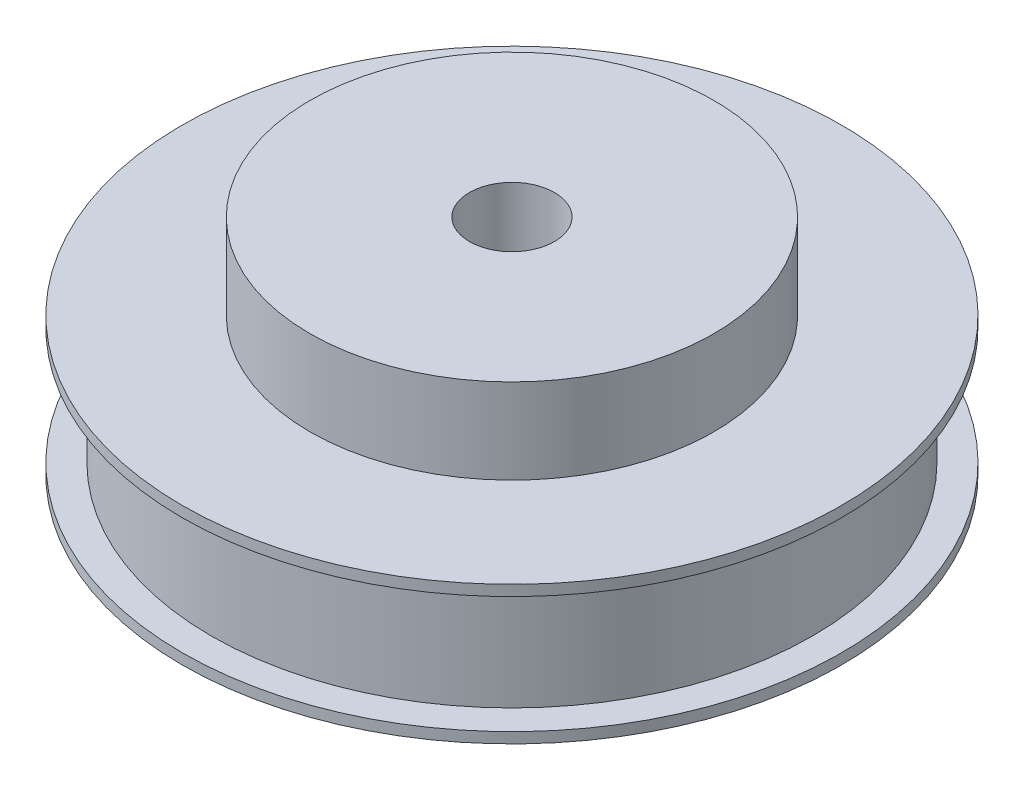
ISO-10303-21;
HEADER;
FILE_DESCRIPTION(('STEP AP214'),'2;1');
FILE_NAME('part.step','',(''),(''),'','','');
FILE_SCHEMA(('AUTOMOTIVE_DESIGN { 1 0 10303 214 1 1 1 1 }'));
ENDSEC;
DATA;
#1=APPLICATION_CONTEXT('core data for automotive mechanical design processes');
#2=APPLICATION_PROTOCOL_DEFINITION('international standard','automotive_design',2000,#1);
#3=PRODUCT_CONTEXT('',#1,'mechanical');
#4=PRODUCT('Part','Part','',(#3));
#5=PRODUCT_RELATED_PRODUCT_CATEGORY('part','',(#4));
#6=PRODUCT_DEFINITION_FORMATION('','',#4);
#7=PRODUCT_DEFINITION_CONTEXT('part definition',#1,'design');
#8=PRODUCT_DEFINITION('design','',#6,#7);
#9=PRODUCT_DEFINITION_SHAPE('','',#8);
#10=(LENGTH_UNIT() NAMED_UNIT(*) SI_UNIT(.MILLI.,.METRE.));
#11=(NAMED_UNIT(*) PLANE_ANGLE_UNIT() SI_UNIT($,.RADIAN.));
#12=(NAMED_UNIT(*) SI_UNIT($,.STERADIAN.) SOLID_ANGLE_UNIT());
#13=UNCERTAINTY_MEASURE_WITH_UNIT(LENGTH_MEASURE(1.E-05),#10,'distance_accuracy_value','');
#14=(GEOMETRIC_REPRESENTATION_CONTEXT(3) GLOBAL_UNCERTAINTY_ASSIGNED_CONTEXT((#13)) GLOBAL_UNIT_ASSIGNED_CONTEXT((#10,
#11,#12)) REPRESENTATION_CONTEXT('',''));
#15=CARTESIAN_POINT('',(0.,0.,0.));
#16=DIRECTION('',(0.,0.,1.));
#17=DIRECTION('',(1.,0.,0.));
#18=AXIS2_PLACEMENT_3D('',#15,#16,#17);
#19=CARTESIAN_POINT('',(0.,1.,0.));
#20=DIRECTION('',(0.,-1.,0.));
#21=DIRECTION('',(0.,0.,-1.));
#22=AXIS2_PLACEMENT_3D('',#19,#20,#21);
#23=CYLINDRICAL_SURFACE('',#22,31.);
#24=CARTESIAN_POINT('',(0.,1.,0.));
#25=DIRECTION('',(0.,1.,0.));
#26=DIRECTION('',(0.,0.,1.));
#27=AXIS2_PLACEMENT_3D('',#24,#25,#26);
#28=CIRCLE('',#27,31.);
#29=CARTESIAN_POINT('',(0.,1.,31.));
#30=VERTEX_POINT('',#29);
#31=EDGE_CURVE('E45',#30,#30,#28,.T.);
#32=ORIENTED_EDGE('',*,*,#31,.F.);
#33=EDGE_LOOP('',(#32));
#34=FACE_BOUND('',#33,.T.);
#35=CARTESIAN_POINT('',(0.,0.,0.));
#36=DIRECTION('',(0.,1.,0.));
#37=DIRECTION('',(0.,0.,1.));
#38=AXIS2_PLACEMENT_3D('',#35,#36,#37);
#39=CIRCLE('',#38,31.);
#40=CARTESIAN_POINT('',(0.,0.,31.));
#41=VERTEX_POINT('',#40);
#42=EDGE_CURVE('E36',#41,#41,#39,.T.);
#43=ORIENTED_EDGE('',*,*,#42,.T.);
#44=EDGE_LOOP('',(#43));
#45=FACE_BOUND('',#44,.T.);
#46=ADVANCED_FACE('F33',(#34,#45),#23,.T.);
#47=CARTESIAN_POINT('',(0.,1.,0.));
#48=DIRECTION('',(0.,1.,0.));
#49=DIRECTION('',(0.,0.,1.));
#50=AXIS2_PLACEMENT_3D('',#47,#48,#49);
#51=PLANE('',#50);
#52=CARTESIAN_POINT('',(0.,1.,0.));
#53=DIRECTION('',(0.,1.,0.));
#54=DIRECTION('',(0.,0.,1.));
#55=AXIS2_PLACEMENT_3D('',#52,#53,#54);
#56=CIRCLE('',#55,28.27);
#57=CARTESIAN_POINT('',(0.,1.,28.27));
#58=VERTEX_POINT('',#57);
#59=EDGE_CURVE('E40',#58,#58,#56,.T.);
#60=ORIENTED_EDGE('',*,*,#59,.F.);
#61=EDGE_LOOP('',(#60));
#62=FACE_BOUND('',#61,.T.);
#63=ORIENTED_EDGE('',*,*,#31,.T.);
#64=EDGE_LOOP('',(#63));
#65=FACE_BOUND('',#64,.T.);
#66=ADVANCED_FACE('F69',(#62,#65),#51,.T.);
#67=CARTESIAN_POINT('',(0.,0.,0.));
#68=DIRECTION('',(0.,1.,0.));
#69=DIRECTION('',(0.,0.,1.));
#70=AXIS2_PLACEMENT_3D('',#67,#68,#69);
#71=PLANE('',#70);
#72=CARTESIAN_POINT('',(0.,0.,0.));
#73=DIRECTION('',(0.,1.,0.));
#74=DIRECTION('',(0.,0.,1.));
#75=AXIS2_PLACEMENT_3D('',#72,#73,#74);
#76=CIRCLE('',#75,4.);
#77=CARTESIAN_POINT('',(0.,0.,4.));
#78=VERTEX_POINT('',#77);
#79=EDGE_CURVE('E164',#78,#78,#76,.T.);
#80=ORIENTED_EDGE('',*,*,#79,.T.);
#81=EDGE_LOOP('',(#80));
#82=FACE_BOUND('',#81,.T.);
#83=ORIENTED_EDGE('',*,*,#42,.F.);
#84=EDGE_LOOP('',(#83));
#85=FACE_BOUND('',#84,.T.);
#86=ADVANCED_FACE('F66',(#82,#85),#71,.F.);
#87=CARTESIAN_POINT('',(0.,12.,0.));
#88=DIRECTION('',(0.,-1.,0.));
#89=DIRECTION('',(0.,0.,-1.));
#90=AXIS2_PLACEMENT_3D('',#87,#88,#89);
#91=CYLINDRICAL_SURFACE('',#90,28.27);
#92=CARTESIAN_POINT('',(0.,12.,0.));
#93=DIRECTION('',(0.,1.,0.));
#94=DIRECTION('',(0.,0.,1.));
#95=AXIS2_PLACEMENT_3D('',#92,#93,#94);
#96=CIRCLE('',#95,28.27);
#97=CARTESIAN_POINT('',(0.,12.,28.27));
#98=VERTEX_POINT('',#97);
#99=EDGE_CURVE('E54',#98,#98,#96,.T.);
#100=ORIENTED_EDGE('',*,*,#99,.F.);
#101=EDGE_LOOP('',(#100));
#102=FACE_BOUND('',#101,.T.);
#103=ORIENTED_EDGE('',*,*,#59,.T.);
#104=EDGE_LOOP('',(#103));
#105=FACE_BOUND('',#104,.T.);
#106=ADVANCED_FACE('F68',(#102,#105),#91,.T.);
#107=CARTESIAN_POINT('',(0.,13.,0.));
#108=DIRECTION('',(0.,-1.,0.));
#109=DIRECTION('',(0.,0.,-1.));
#110=AXIS2_PLACEMENT_3D('',#107,#108,#109);
#111=CYLINDRICAL_SURFACE('',#110,31.);
#112=CARTESIAN_POINT('',(0.,13.,0.));
#113=DIRECTION('',(0.,1.,0.));
#114=DIRECTION('',(0.,0.,1.));
#115=AXIS2_PLACEMENT_3D('',#112,#113,#114);
#116=CIRCLE('',#115,31.);
#117=CARTESIAN_POINT('',(0.,13.,31.));
#118=VERTEX_POINT('',#117);
#119=EDGE_CURVE('E51',#118,#118,#116,.T.);
#120=ORIENTED_EDGE('',*,*,#119,.F.);
#121=EDGE_LOOP('',(#120));
#122=FACE_BOUND('',#121,.T.);
#123=CARTESIAN_POINT('',(0.,12.,0.));
#124=DIRECTION('',(0.,1.,0.));
#125=DIRECTION('',(0.,0.,1.));
#126=AXIS2_PLACEMENT_3D('',#123,#124,#125);
#127=CIRCLE('',#126,31.);
#128=CARTESIAN_POINT('',(0.,12.,31.));
#129=VERTEX_POINT('',#128);
#130=EDGE_CURVE('E55',#129,#129,#127,.T.);
#131=ORIENTED_EDGE('',*,*,#130,.T.);
#132=EDGE_LOOP('',(#131));
#133=FACE_BOUND('',#132,.T.);
#134=ADVANCED_FACE('F75',(#122,#133),#111,.T.);
#135=CARTESIAN_POINT('',(0.,13.,0.));
#136=DIRECTION('',(0.,1.,0.));
#137=DIRECTION('',(0.,0.,1.));
#138=AXIS2_PLACEMENT_3D('',#135,#136,#137);
#139=PLANE('',#138);
#140=CARTESIAN_POINT('',(0.,13.,0.));
#141=DIRECTION('',(0.,1.,0.));
#142=DIRECTION('',(0.,0.,1.));
#143=AXIS2_PLACEMENT_3D('',#140,#141,#142);
#144=CIRCLE('',#143,19.);
#145=CARTESIAN_POINT('',(0.,13.,19.));
#146=VERTEX_POINT('',#145);
#147=EDGE_CURVE('E10',#146,#146,#144,.T.);
#148=ORIENTED_EDGE('',*,*,#147,.F.);
#149=EDGE_LOOP('',(#148));
#150=FACE_BOUND('',#149,.T.);
#151=ORIENTED_EDGE('',*,*,#119,.T.);
#152=EDGE_LOOP('',(#151));
#153=FACE_BOUND('',#152,.T.);
#154=ADVANCED_FACE('F105',(#150,#153),#139,.T.);
#155=CARTESIAN_POINT('',(0.,12.,0.));
#156=DIRECTION('',(0.,1.,0.));
#157=DIRECTION('',(0.,0.,1.));
#158=AXIS2_PLACEMENT_3D('',#155,#156,#157);
#159=PLANE('',#158);
#160=ORIENTED_EDGE('',*,*,#99,.T.);
#161=EDGE_LOOP('',(#160));
#162=FACE_BOUND('',#161,.T.);
#163=ORIENTED_EDGE('',*,*,#130,.F.);
#164=EDGE_LOOP('',(#163));
#165=FACE_BOUND('',#164,.T.);
#166=ADVANCED_FACE('F113',(#162,#165),#159,.F.);
#167=CARTESIAN_POINT('',(0.,21.,0.));
#168=DIRECTION('',(0.,-1.,0.));
#169=DIRECTION('',(0.,0.,-1.));
#170=AXIS2_PLACEMENT_3D('',#167,#168,#169);
#171=CYLINDRICAL_SURFACE('',#170,19.);
#172=CARTESIAN_POINT('',(0.,21.,0.));
#173=DIRECTION('',(0.,1.,0.));
#174=DIRECTION('',(0.,0.,1.));
#175=AXIS2_PLACEMENT_3D('',#172,#173,#174);
#176=CIRCLE('',#175,19.);
#177=CARTESIAN_POINT('',(0.,21.,19.));
#178=VERTEX_POINT('',#177);
#179=EDGE_CURVE('E49',#178,#178,#176,.T.);
#180=ORIENTED_EDGE('',*,*,#179,.F.);
#181=EDGE_LOOP('',(#180));
#182=FACE_BOUND('',#181,.T.);
#183=ORIENTED_EDGE('',*,*,#147,.T.);
#184=EDGE_LOOP('',(#183));
#185=FACE_BOUND('',#184,.T.);
#186=ADVANCED_FACE('F118',(#182,#185),#171,.T.);
#187=CARTESIAN_POINT('',(0.,21.,0.));
#188=DIRECTION('',(0.,1.,0.));
#189=DIRECTION('',(0.,0.,1.));
#190=AXIS2_PLACEMENT_3D('',#187,#188,#189);
#191=PLANE('',#190);
#192=CARTESIAN_POINT('',(0.,21.,0.));
#193=DIRECTION('',(0.,1.,0.));
#194=DIRECTION('',(0.,0.,1.));
#195=AXIS2_PLACEMENT_3D('',#192,#193,#194);
#196=CIRCLE('',#195,4.);
#197=CARTESIAN_POINT('',(0.,21.,4.));
#198=VERTEX_POINT('',#197);
#199=EDGE_CURVE('E167',#198,#198,#196,.T.);
#200=ORIENTED_EDGE('',*,*,#199,.F.);
#201=EDGE_LOOP('',(#200));
#202=FACE_BOUND('',#201,.T.);
#203=ORIENTED_EDGE('',*,*,#179,.T.);
#204=EDGE_LOOP('',(#203));
#205=FACE_BOUND('',#204,.T.);
#206=ADVANCED_FACE('F134',(#202,#205),#191,.T.);
#207=CARTESIAN_POINT('',(0.,0.,0.));
#208=DIRECTION('',(0.,1.,0.));
#209=DIRECTION('',(0.,0.,1.));
#210=AXIS2_PLACEMENT_3D('',#207,#208,#209);
#211=CYLINDRICAL_SURFACE('',#210,4.);
#212=CARTESIAN_POINT('',(0.,0.,4.));
#213=CARTESIAN_POINT('',(0.,0.21875,4.));
#214=CARTESIAN_POINT('',(0.,0.4375,4.));
#215=CARTESIAN_POINT('',(0.,0.875,4.));
#216=CARTESIAN_POINT('',(0.,1.09375,4.));
#217=CARTESIAN_POINT('',(0.,1.53125,4.));
#218=CARTESIAN_POINT('',(0.,1.75,4.));
#219=CARTESIAN_POINT('',(0.,2.1875,4.));
#220=CARTESIAN_POINT('',(0.,2.40625,4.));
#221=CARTESIAN_POINT('',(0.,2.84375,4.));
#222=CARTESIAN_POINT('',(0.,3.0625,4.));
#223=CARTESIAN_POINT('',(0.,3.5,4.));
#224=CARTESIAN_POINT('',(0.,3.71875,4.));
#225=CARTESIAN_POINT('',(0.,4.15625,4.));
#226=CARTESIAN_POINT('',(0.,4.375,4.));
#227=CARTESIAN_POINT('',(0.,4.8125,4.));
#228=CARTESIAN_POINT('',(0.,5.03125,4.));
#229=CARTESIAN_POINT('',(0.,5.46875,4.));
#230=CARTESIAN_POINT('',(0.,5.6875,4.));
#231=CARTESIAN_POINT('',(0.,6.125,4.));
#232=CARTESIAN_POINT('',(0.,6.34375,4.));
#233=CARTESIAN_POINT('',(0.,6.78125,4.));
#234=CARTESIAN_POINT('',(0.,7.,4.));
#235=CARTESIAN_POINT('',(0.,7.4375,4.));
#236=CARTESIAN_POINT('',(0.,7.65625,4.));
#237=CARTESIAN_POINT('',(0.,8.09375,4.));
#238=CARTESIAN_POINT('',(0.,8.3125,4.));
#239=CARTESIAN_POINT('',(0.,8.75,4.));
#240=CARTESIAN_POINT('',(0.,8.96875,4.));
#241=CARTESIAN_POINT('',(0.,9.40625,4.));
#242=CARTESIAN_POINT('',(0.,9.625,4.));
#243=CARTESIAN_POINT('',(0.,10.0625,4.));
#244=CARTESIAN_POINT('',(0.,10.28125,4.));
#245=CARTESIAN_POINT('',(0.,10.71875,4.));
#246=CARTESIAN_POINT('',(0.,10.9375,4.));
#247=CARTESIAN_POINT('',(0.,11.375,4.));
#248=CARTESIAN_POINT('',(0.,11.59375,4.));
#249=CARTESIAN_POINT('',(0.,12.03125,4.));
#250=CARTESIAN_POINT('',(0.,12.25,4.));
#251=CARTESIAN_POINT('',(0.,12.6875,4.));
#252=CARTESIAN_POINT('',(0.,12.90625,4.));
#253=CARTESIAN_POINT('',(0.,13.34375,4.));
#254=CARTESIAN_POINT('',(0.,13.5625,4.));
#255=CARTESIAN_POINT('',(0.,14.,4.));
#256=CARTESIAN_POINT('',(0.,14.21875,4.));
#257=CARTESIAN_POINT('',(0.,14.65625,4.));
#258=CARTESIAN_POINT('',(0.,14.875,4.));
#259=CARTESIAN_POINT('',(0.,15.3125,4.));
#260=CARTESIAN_POINT('',(0.,15.53125,4.));
#261=CARTESIAN_POINT('',(0.,15.96875,4.));
#262=CARTESIAN_POINT('',(0.,16.1875,4.));
#263=CARTESIAN_POINT('',(0.,16.625,4.));
#264=CARTESIAN_POINT('',(0.,16.84375,4.));
#265=CARTESIAN_POINT('',(0.,17.28125,4.));
#266=CARTESIAN_POINT('',(0.,17.5,4.));
#267=CARTESIAN_POINT('',(0.,17.9375,4.));
#268=CARTESIAN_POINT('',(0.,18.15625,4.));
#269=CARTESIAN_POINT('',(0.,18.59375,4.));
#270=CARTESIAN_POINT('',(0.,18.8125,4.));
#271=CARTESIAN_POINT('',(0.,19.25,4.));
#272=CARTESIAN_POINT('',(0.,19.46875,4.));
#273=CARTESIAN_POINT('',(0.,19.90625,4.));
#274=CARTESIAN_POINT('',(0.,20.125,4.));
#275=CARTESIAN_POINT('',(0.,20.5625,4.));
#276=CARTESIAN_POINT('',(0.,20.78125,4.));
#277=CARTESIAN_POINT('',(0.,21.,4.));
#278=B_SPLINE_CURVE_WITH_KNOTS('',3,(#212,#213,#214,#215,#216,#217,#218,#219,#220,#221,#222,
#223,#224,#225,#226,#227,#228,#229,#230,#231,#232,#233,#234,#235,#236,#237,#238,#239,#240,#241,
#242,#243,#244,#245,#246,#247,#248,#249,#250,#251,#252,#253,#254,#255,#256,#257,#258,#259,#260,
#261,#262,#263,#264,#265,#266,#267,#268,#269,#270,#271,#272,#273,#274,#275,#276,#277),
.UNSPECIFIED.,.F.,.F.,(4,2,2,2,2,2,2,2,2,2,2,2,2,2,2,2,2,2,2,2,2,2,2,2,2,2,2,2,2,2,2,2,4),(0.,
0.65625,1.3125,1.96875,2.625,3.28125,3.9375,4.59375,5.25,5.90625,6.5625,7.21875,7.875,8.53125,
9.1875,9.84375,10.5,11.15625,11.8125,12.46875,13.125,13.78125,14.4375,15.09375,15.75,16.40625,
17.0625,17.71875,18.375,19.03125,19.6875,20.34375,21.),.UNSPECIFIED.);
#279=EDGE_CURVE('BSEAM148',#78,#198,#278,.T.);
#280=ORIENTED_EDGE('',*,*,#79,.F.);
#281=ORIENTED_EDGE('',*,*,#199,.T.);
#282=ORIENTED_EDGE('',*,*,#279,.T.);
#283=ORIENTED_EDGE('',*,*,#279,.F.);
#284=EDGE_LOOP('',(#280,#282,#281,#283));
#285=FACE_BOUND('',#284,.T.);
#286=ADVANCED_FACE('F148',(#285),#211,.F.);
#287=CLOSED_SHELL('',(#46,#66,#86,#106,#134,#154,#166,#186,#206,#286));
#288=MANIFOLD_SOLID_BREP('B2',#287);
#289=ADVANCED_BREP_SHAPE_REPRESENTATION('',(#18,#288),#14);
#290=SHAPE_DEFINITION_REPRESENTATION(#9,#289);
ENDSEC;
END-ISO-10303-21;
